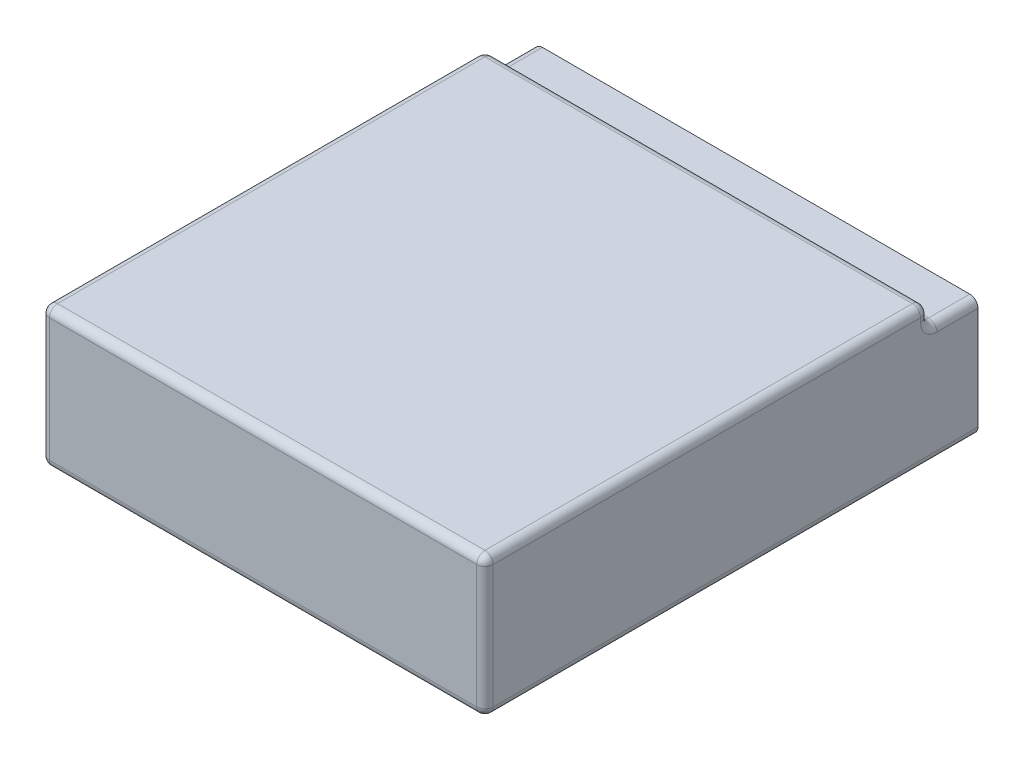
ISO-10303-21;
HEADER;
FILE_DESCRIPTION(('STEP AP214'),'2;1');
FILE_NAME('part.step','',(''),(''),'','','');
FILE_SCHEMA(('AUTOMOTIVE_DESIGN { 1 0 10303 214 1 1 1 1 }'));
ENDSEC;
DATA;
#1=APPLICATION_CONTEXT('core data for automotive mechanical design processes');
#2=APPLICATION_PROTOCOL_DEFINITION('international standard','automotive_design',2000,#1);
#3=PRODUCT_CONTEXT('',#1,'mechanical');
#4=PRODUCT('Part','Part','',(#3));
#5=PRODUCT_RELATED_PRODUCT_CATEGORY('part','',(#4));
#6=PRODUCT_DEFINITION_FORMATION('','',#4);
#7=PRODUCT_DEFINITION_CONTEXT('part definition',#1,'design');
#8=PRODUCT_DEFINITION('design','',#6,#7);
#9=PRODUCT_DEFINITION_SHAPE('','',#8);
#10=(LENGTH_UNIT() NAMED_UNIT(*) SI_UNIT(.MILLI.,.METRE.));
#11=(NAMED_UNIT(*) PLANE_ANGLE_UNIT() SI_UNIT($,.RADIAN.));
#12=(NAMED_UNIT(*) SI_UNIT($,.STERADIAN.) SOLID_ANGLE_UNIT());
#13=UNCERTAINTY_MEASURE_WITH_UNIT(LENGTH_MEASURE(1.E-05),#10,'distance_accuracy_value','');
#14=(GEOMETRIC_REPRESENTATION_CONTEXT(3) GLOBAL_UNCERTAINTY_ASSIGNED_CONTEXT((#13)) GLOBAL_UNIT_ASSIGNED_CONTEXT((#10,
#11,#12)) REPRESENTATION_CONTEXT('',''));
#15=CARTESIAN_POINT('',(0.,0.,0.));
#16=DIRECTION('',(0.,0.,1.));
#17=DIRECTION('',(1.,0.,0.));
#18=AXIS2_PLACEMENT_3D('',#15,#16,#17);
#19=CARTESIAN_POINT('',(-29.0445265915073,17.,-29.770639756295));
#20=DIRECTION('',(1.,0.,0.));
#21=DIRECTION('',(0.,0.,-1.));
#22=AXIS2_PLACEMENT_3D('',#19,#20,#21);
#23=PLANE('',#22);
#24=CARTESIAN_POINT('',(-29.0445265915073,15.5,-24.770639756295));
#25=DIRECTION('',(1.,0.,0.));
#26=DIRECTION('',(0.,0.,-1.));
#27=AXIS2_PLACEMENT_3D('',#24,#25,#26);
#28=CIRCLE('',#27,2.);
#29=CARTESIAN_POINT('',(-29.0445265915073,13.5,-24.770639756295));
#30=VERTEX_POINT('',#29);
#31=CARTESIAN_POINT('',(-29.0445265915073,15.5,-22.770639756295));
#32=VERTEX_POINT('',#31);
#33=EDGE_CURVE('E322',#30,#32,#28,.F.);
#34=ORIENTED_EDGE('',*,*,#33,.F.);
#35=DIRECTION('',(0.,0.,1.));
#36=VECTOR('',#35,1.);
#37=CARTESIAN_POINT('',(-29.0445265915073,13.5,-29.770639756295));
#38=LINE('',#37,#36);
#39=CARTESIAN_POINT('',(-29.0445265915073,13.5,-29.770639756295));
#40=VERTEX_POINT('',#39);
#41=EDGE_CURVE('E325',#30,#40,#38,.F.);
#42=ORIENTED_EDGE('',*,*,#41,.T.);
#43=DIRECTION('',(0.,-1.,0.));
#44=VECTOR('',#43,1.);
#45=CARTESIAN_POINT('',(-29.0445265915073,17.,-29.770639756295));
#46=LINE('',#45,#44);
#47=CARTESIAN_POINT('',(-29.0445265915073,1.,-29.770639756295));
#48=VERTEX_POINT('',#47);
#49=EDGE_CURVE('E306',#40,#48,#46,.T.);
#50=ORIENTED_EDGE('',*,*,#49,.T.);
#51=DIRECTION('',(0.,0.,1.));
#52=VECTOR('',#51,1.);
#53=CARTESIAN_POINT('',(-29.0445265915073,1.,-29.770639756295));
#54=LINE('',#53,#52);
#55=CARTESIAN_POINT('',(-29.0445265915073,1.,29.229360243705));
#56=VERTEX_POINT('',#55);
#57=EDGE_CURVE('E318',#48,#56,#54,.T.);
#58=ORIENTED_EDGE('',*,*,#57,.T.);
#59=DIRECTION('',(0.,-1.,0.));
#60=VECTOR('',#59,1.);
#61=CARTESIAN_POINT('',(-29.0445265915073,17.,29.229360243705));
#62=LINE('',#61,#60);
#63=CARTESIAN_POINT('',(-29.0445265915073,16.,29.229360243705));
#64=VERTEX_POINT('',#63);
#65=EDGE_CURVE('E314',#56,#64,#62,.F.);
#66=ORIENTED_EDGE('',*,*,#65,.T.);
#67=DIRECTION('',(0.,0.,1.));
#68=VECTOR('',#67,1.);
#69=CARTESIAN_POINT('',(-29.0445265915073,16.,-23.770639756295));
#70=LINE('',#69,#68);
#71=CARTESIAN_POINT('',(-29.0445265915073,16.,-22.770639756295));
#72=VERTEX_POINT('',#71);
#73=EDGE_CURVE('E316',#64,#72,#70,.F.);
#74=ORIENTED_EDGE('',*,*,#73,.T.);
#75=DIRECTION('',(0.,1.,0.));
#76=VECTOR('',#75,1.);
#77=CARTESIAN_POINT('',(-29.0445265915073,17.,-22.770639756295));
#78=LINE('',#77,#76);
#79=EDGE_CURVE('E320',#72,#32,#78,.F.);
#80=ORIENTED_EDGE('',*,*,#79,.T.);
#81=EDGE_LOOP('',(#34,#42,#50,#58,#66,#74,#80));
#82=FACE_BOUND('',#81,.T.);
#83=ADVANCED_FACE('F33',(#82),#23,.F.);
#84=CARTESIAN_POINT('',(-29.0445265915073,17.,30.229360243705));
#85=DIRECTION('',(0.,0.,-1.));
#86=DIRECTION('',(-1.,0.,0.));
#87=AXIS2_PLACEMENT_3D('',#84,#85,#86);
#88=PLANE('',#87);
#89=DIRECTION('',(1.,0.,0.));
#90=VECTOR('',#89,1.);
#91=CARTESIAN_POINT('',(-29.0445265915073,16.,30.229360243705));
#92=LINE('',#91,#90);
#93=CARTESIAN_POINT('',(23.9554734084927,16.,30.229360243705));
#94=VERTEX_POINT('',#93);
#95=CARTESIAN_POINT('',(-28.0445265915073,16.,30.229360243705));
#96=VERTEX_POINT('',#95);
#97=EDGE_CURVE('E53',#94,#96,#92,.F.);
#98=ORIENTED_EDGE('',*,*,#97,.T.);
#99=DIRECTION('',(0.,-1.,0.));
#100=VECTOR('',#99,1.);
#101=CARTESIAN_POINT('',(-28.0445265915073,17.,30.229360243705));
#102=LINE('',#101,#100);
#103=CARTESIAN_POINT('',(-28.0445265915073,1.,30.229360243705));
#104=VERTEX_POINT('',#103);
#105=EDGE_CURVE('E11',#96,#104,#102,.T.);
#106=ORIENTED_EDGE('',*,*,#105,.T.);
#107=DIRECTION('',(1.,0.,0.));
#108=VECTOR('',#107,1.);
#109=CARTESIAN_POINT('',(-29.0445265915073,1.,30.229360243705));
#110=LINE('',#109,#108);
#111=CARTESIAN_POINT('',(23.9554734084927,1.,30.229360243705));
#112=VERTEX_POINT('',#111);
#113=EDGE_CURVE('E42',#104,#112,#110,.T.);
#114=ORIENTED_EDGE('',*,*,#113,.T.);
#115=DIRECTION('',(0.,-1.,0.));
#116=VECTOR('',#115,1.);
#117=CARTESIAN_POINT('',(23.9554734084927,17.,30.229360243705));
#118=LINE('',#117,#116);
#119=EDGE_CURVE('E221',#112,#94,#118,.F.);
#120=ORIENTED_EDGE('',*,*,#119,.T.);
#121=EDGE_LOOP('',(#98,#106,#114,#120));
#122=FACE_BOUND('',#121,.T.);
#123=ADVANCED_FACE('F383',(#122),#88,.F.);
#124=CARTESIAN_POINT('',(24.9554734084927,17.,-29.770639756295));
#125=DIRECTION('',(-1.,0.,0.));
#126=DIRECTION('',(0.,0.,1.));
#127=AXIS2_PLACEMENT_3D('',#124,#125,#126);
#128=PLANE('',#127);
#129=DIRECTION('',(0.,-1.,0.));
#130=VECTOR('',#129,1.);
#131=CARTESIAN_POINT('',(24.9554734084927,17.,29.229360243705));
#132=LINE('',#131,#130);
#133=CARTESIAN_POINT('',(24.9554734084927,16.,29.229360243705));
#134=VERTEX_POINT('',#133);
#135=CARTESIAN_POINT('',(24.9554734084927,1.,29.229360243705));
#136=VERTEX_POINT('',#135);
#137=EDGE_CURVE('E187',#134,#136,#132,.T.);
#138=ORIENTED_EDGE('',*,*,#137,.T.);
#139=DIRECTION('',(0.,0.,-1.));
#140=VECTOR('',#139,1.);
#141=CARTESIAN_POINT('',(24.9554734084927,1.,-29.770639756295));
#142=LINE('',#141,#140);
#143=CARTESIAN_POINT('',(24.9554734084927,1.,-29.770639756295));
#144=VERTEX_POINT('',#143);
#145=EDGE_CURVE('E195',#136,#144,#142,.T.);
#146=ORIENTED_EDGE('',*,*,#145,.T.);
#147=DIRECTION('',(0.,-1.,0.));
#148=VECTOR('',#147,1.);
#149=CARTESIAN_POINT('',(24.9554734084927,17.,-29.770639756295));
#150=LINE('',#149,#148);
#151=CARTESIAN_POINT('',(24.9554734084927,13.5,-29.770639756295));
#152=VERTEX_POINT('',#151);
#153=EDGE_CURVE('E303',#152,#144,#150,.T.);
#154=ORIENTED_EDGE('',*,*,#153,.F.);
#155=DIRECTION('',(0.,0.,-1.));
#156=VECTOR('',#155,1.);
#157=CARTESIAN_POINT('',(24.9554734084927,13.5,-29.770639756295));
#158=LINE('',#157,#156);
#159=CARTESIAN_POINT('',(24.9554734084927,13.5,-24.770639756295));
#160=VERTEX_POINT('',#159);
#161=EDGE_CURVE('E177',#152,#160,#158,.F.);
#162=ORIENTED_EDGE('',*,*,#161,.T.);
#163=CARTESIAN_POINT('',(24.9554734084927,15.5,-24.770639756295));
#164=DIRECTION('',(-1.,0.,0.));
#165=DIRECTION('',(0.,0.,1.));
#166=AXIS2_PLACEMENT_3D('',#163,#164,#165);
#167=CIRCLE('',#166,2.);
#168=CARTESIAN_POINT('',(24.9554734084927,15.5,-22.770639756295));
#169=VERTEX_POINT('',#168);
#170=EDGE_CURVE('E191',#169,#160,#167,.F.);
#171=ORIENTED_EDGE('',*,*,#170,.F.);
#172=DIRECTION('',(0.,1.,0.));
#173=VECTOR('',#172,1.);
#174=CARTESIAN_POINT('',(24.9554734084927,17.,-22.770639756295));
#175=LINE('',#174,#173);
#176=CARTESIAN_POINT('',(24.9554734084927,16.,-22.770639756295));
#177=VERTEX_POINT('',#176);
#178=EDGE_CURVE('E189',#169,#177,#175,.T.);
#179=ORIENTED_EDGE('',*,*,#178,.T.);
#180=DIRECTION('',(0.,0.,-1.));
#181=VECTOR('',#180,1.);
#182=CARTESIAN_POINT('',(24.9554734084927,16.,30.229360243705));
#183=LINE('',#182,#181);
#184=EDGE_CURVE('E180',#177,#134,#183,.F.);
#185=ORIENTED_EDGE('',*,*,#184,.T.);
#186=EDGE_LOOP('',(#138,#146,#154,#162,#171,#179,#185));
#187=FACE_BOUND('',#186,.T.);
#188=ADVANCED_FACE('F302',(#187),#128,.F.);
#189=CARTESIAN_POINT('',(-29.0445265915073,17.,-29.770639756295));
#190=DIRECTION('',(0.,0.,1.));
#191=DIRECTION('',(1.,0.,0.));
#192=AXIS2_PLACEMENT_3D('',#189,#190,#191);
#193=PLANE('',#192);
#194=ORIENTED_EDGE('',*,*,#49,.F.);
#195=CARTESIAN_POINT('',(-28.0445265915073,13.5,-29.770639756295));
#196=DIRECTION('',(0.,0.,1.));
#197=DIRECTION('',(1.,0.,0.));
#198=AXIS2_PLACEMENT_3D('',#195,#196,#197);
#199=CIRCLE('',#198,1.);
#200=CARTESIAN_POINT('',(-28.0445265915073,14.5,-29.770639756295));
#201=VERTEX_POINT('',#200);
#202=EDGE_CURVE('E172',#40,#201,#199,.F.);
#203=ORIENTED_EDGE('',*,*,#202,.T.);
#204=DIRECTION('',(-1.,0.,0.));
#205=VECTOR('',#204,1.);
#206=CARTESIAN_POINT('',(-29.0445265915073,14.5,-29.770639756295));
#207=LINE('',#206,#205);
#208=CARTESIAN_POINT('',(23.9554734084927,14.5,-29.770639756295));
#209=VERTEX_POINT('',#208);
#210=EDGE_CURVE('E155',#209,#201,#207,.T.);
#211=ORIENTED_EDGE('',*,*,#210,.F.);
#212=CARTESIAN_POINT('',(23.9554734084927,13.5,-29.770639756295));
#213=DIRECTION('',(0.,0.,1.));
#214=DIRECTION('',(1.,0.,0.));
#215=AXIS2_PLACEMENT_3D('',#212,#213,#214);
#216=CIRCLE('',#215,1.);
#217=EDGE_CURVE('E169',#209,#152,#216,.F.);
#218=ORIENTED_EDGE('',*,*,#217,.T.);
#219=ORIENTED_EDGE('',*,*,#153,.T.);
#220=CARTESIAN_POINT('',(23.9554734084927,1.,-29.770639756295));
#221=DIRECTION('',(0.,0.,1.));
#222=DIRECTION('',(1.,0.,0.));
#223=AXIS2_PLACEMENT_3D('',#220,#221,#222);
#224=CIRCLE('',#223,1.);
#225=CARTESIAN_POINT('',(23.9554734084927,0.,-29.770639756295));
#226=VERTEX_POINT('',#225);
#227=EDGE_CURVE('E182',#144,#226,#224,.F.);
#228=ORIENTED_EDGE('',*,*,#227,.T.);
#229=DIRECTION('',(-1.,0.,0.));
#230=VECTOR('',#229,1.);
#231=CARTESIAN_POINT('',(-29.0445265915073,0.,-29.770639756295));
#232=LINE('',#231,#230);
#233=CARTESIAN_POINT('',(-28.0445265915073,0.,-29.770639756295));
#234=VERTEX_POINT('',#233);
#235=EDGE_CURVE('E173',#226,#234,#232,.T.);
#236=ORIENTED_EDGE('',*,*,#235,.T.);
#237=CARTESIAN_POINT('',(-28.0445265915073,1.,-29.770639756295));
#238=DIRECTION('',(0.,0.,1.));
#239=DIRECTION('',(1.,0.,0.));
#240=AXIS2_PLACEMENT_3D('',#237,#238,#239);
#241=CIRCLE('',#240,1.);
#242=EDGE_CURVE('E178',#234,#48,#241,.F.);
#243=ORIENTED_EDGE('',*,*,#242,.T.);
#244=EDGE_LOOP('',(#194,#203,#211,#218,#219,#228,#236,#243));
#245=FACE_BOUND('',#244,.T.);
#246=ADVANCED_FACE('F167',(#245),#193,.F.);
#247=CARTESIAN_POINT('',(0.,17.,0.));
#248=DIRECTION('',(0.,1.,0.));
#249=DIRECTION('',(0.,0.,1.));
#250=AXIS2_PLACEMENT_3D('',#247,#248,#249);
#251=PLANE('',#250);
#252=DIRECTION('',(0.,0.,-1.));
#253=VECTOR('',#252,1.);
#254=CARTESIAN_POINT('',(23.9554734084927,17.,-23.770639756295));
#255=LINE('',#254,#253);
#256=CARTESIAN_POINT('',(23.9554734084927,17.,29.229360243705));
#257=VERTEX_POINT('',#256);
#258=CARTESIAN_POINT('',(23.9554734084927,17.,-22.770639756295));
#259=VERTEX_POINT('',#258);
#260=EDGE_CURVE('E206',#257,#259,#255,.T.);
#261=ORIENTED_EDGE('',*,*,#260,.T.);
#262=DIRECTION('',(1.,0.,0.));
#263=VECTOR('',#262,1.);
#264=CARTESIAN_POINT('',(-29.0445265915073,17.,-22.770639756295));
#265=LINE('',#264,#263);
#266=CARTESIAN_POINT('',(-28.0445265915073,17.,-22.770639756295));
#267=VERTEX_POINT('',#266);
#268=EDGE_CURVE('E212',#259,#267,#265,.F.);
#269=ORIENTED_EDGE('',*,*,#268,.T.);
#270=DIRECTION('',(0.,0.,1.));
#271=VECTOR('',#270,1.);
#272=CARTESIAN_POINT('',(-28.0445265915073,17.,30.229360243705));
#273=LINE('',#272,#271);
#274=CARTESIAN_POINT('',(-28.0445265915073,17.,29.229360243705));
#275=VERTEX_POINT('',#274);
#276=EDGE_CURVE('E210',#267,#275,#273,.T.);
#277=ORIENTED_EDGE('',*,*,#276,.T.);
#278=DIRECTION('',(1.,0.,0.));
#279=VECTOR('',#278,1.);
#280=CARTESIAN_POINT('',(24.9554734084927,17.,29.229360243705));
#281=LINE('',#280,#279);
#282=EDGE_CURVE('E208',#275,#257,#281,.T.);
#283=ORIENTED_EDGE('',*,*,#282,.T.);
#284=EDGE_LOOP('',(#261,#269,#277,#283));
#285=FACE_BOUND('',#284,.T.);
#286=ADVANCED_FACE('F459',(#285),#251,.T.);
#287=CARTESIAN_POINT('',(0.,0.,0.));
#288=DIRECTION('',(0.,1.,0.));
#289=DIRECTION('',(0.,0.,1.));
#290=AXIS2_PLACEMENT_3D('',#287,#288,#289);
#291=PLANE('',#290);
#292=DIRECTION('',(1.,0.,0.));
#293=VECTOR('',#292,1.);
#294=CARTESIAN_POINT('',(0.,0.,29.229360243705));
#295=LINE('',#294,#293);
#296=CARTESIAN_POINT('',(23.9554734084927,0.,29.229360243705));
#297=VERTEX_POINT('',#296);
#298=CARTESIAN_POINT('',(-28.0445265915073,0.,29.229360243705));
#299=VERTEX_POINT('',#298);
#300=EDGE_CURVE('E217',#297,#299,#295,.F.);
#301=ORIENTED_EDGE('',*,*,#300,.T.);
#302=DIRECTION('',(0.,0.,1.));
#303=VECTOR('',#302,1.);
#304=CARTESIAN_POINT('',(-28.0445265915073,0.,0.));
#305=LINE('',#304,#303);
#306=EDGE_CURVE('E219',#299,#234,#305,.F.);
#307=ORIENTED_EDGE('',*,*,#306,.T.);
#308=ORIENTED_EDGE('',*,*,#235,.F.);
#309=DIRECTION('',(0.,0.,-1.));
#310=VECTOR('',#309,1.);
#311=CARTESIAN_POINT('',(23.9554734084927,0.,0.));
#312=LINE('',#311,#310);
#313=EDGE_CURVE('E215',#226,#297,#312,.F.);
#314=ORIENTED_EDGE('',*,*,#313,.T.);
#315=EDGE_LOOP('',(#301,#307,#308,#314));
#316=FACE_BOUND('',#315,.T.);
#317=ADVANCED_FACE('F455',(#316),#291,.F.);
#318=CARTESIAN_POINT('',(-29.0445265915073,14.5,-23.770639756295));
#319=DIRECTION('',(0.,0.,1.));
#320=DIRECTION('',(1.,0.,0.));
#321=AXIS2_PLACEMENT_3D('',#318,#319,#320);
#322=PLANE('',#321);
#323=DIRECTION('',(0.,1.,0.));
#324=VECTOR('',#323,1.);
#325=CARTESIAN_POINT('',(23.9554734084927,14.5,-23.770639756295));
#326=LINE('',#325,#324);
#327=CARTESIAN_POINT('',(23.9554734084927,16.,-23.770639756295));
#328=VERTEX_POINT('',#327);
#329=CARTESIAN_POINT('',(23.9554734084927,15.5,-23.770639756295));
#330=VERTEX_POINT('',#329);
#331=EDGE_CURVE('E199',#328,#330,#326,.F.);
#332=ORIENTED_EDGE('',*,*,#331,.T.);
#333=DIRECTION('',(1.,0.,0.));
#334=VECTOR('',#333,1.);
#335=CARTESIAN_POINT('',(-29.0445265915073,15.5,-23.770639756295));
#336=LINE('',#335,#334);
#337=CARTESIAN_POINT('',(-28.0445265915073,15.5,-23.770639756295));
#338=VERTEX_POINT('',#337);
#339=EDGE_CURVE('E204',#330,#338,#336,.F.);
#340=ORIENTED_EDGE('',*,*,#339,.T.);
#341=DIRECTION('',(0.,1.,0.));
#342=VECTOR('',#341,1.);
#343=CARTESIAN_POINT('',(-28.0445265915073,14.5,-23.770639756295));
#344=LINE('',#343,#342);
#345=CARTESIAN_POINT('',(-28.0445265915073,16.,-23.770639756295));
#346=VERTEX_POINT('',#345);
#347=EDGE_CURVE('E201',#338,#346,#344,.T.);
#348=ORIENTED_EDGE('',*,*,#347,.T.);
#349=DIRECTION('',(1.,0.,0.));
#350=VECTOR('',#349,1.);
#351=CARTESIAN_POINT('',(24.9554734084927,16.,-23.770639756295));
#352=LINE('',#351,#350);
#353=EDGE_CURVE('E197',#346,#328,#352,.T.);
#354=ORIENTED_EDGE('',*,*,#353,.T.);
#355=EDGE_LOOP('',(#332,#340,#348,#354));
#356=FACE_BOUND('',#355,.T.);
#357=ADVANCED_FACE('F450',(#356),#322,.F.);
#358=CARTESIAN_POINT('',(0.,14.5,0.));
#359=DIRECTION('',(0.,-1.,0.));
#360=DIRECTION('',(0.,0.,-1.));
#361=AXIS2_PLACEMENT_3D('',#358,#359,#360);
#362=PLANE('',#361);
#363=ORIENTED_EDGE('',*,*,#210,.T.);
#364=DIRECTION('',(0.,0.,1.));
#365=VECTOR('',#364,1.);
#366=CARTESIAN_POINT('',(-28.0445265915073,14.5,0.));
#367=LINE('',#366,#365);
#368=CARTESIAN_POINT('',(-28.0445265915073,14.5,-24.770639756295));
#369=VERTEX_POINT('',#368);
#370=EDGE_CURVE('E163',#201,#369,#367,.T.);
#371=ORIENTED_EDGE('',*,*,#370,.T.);
#372=DIRECTION('',(1.,0.,0.));
#373=VECTOR('',#372,1.);
#374=CARTESIAN_POINT('',(24.9554734084927,14.5,-24.770639756295));
#375=LINE('',#374,#373);
#376=CARTESIAN_POINT('',(23.9554734084927,14.5,-24.770639756295));
#377=VERTEX_POINT('',#376);
#378=EDGE_CURVE('E158',#369,#377,#375,.T.);
#379=ORIENTED_EDGE('',*,*,#378,.T.);
#380=DIRECTION('',(0.,0.,-1.));
#381=VECTOR('',#380,1.);
#382=CARTESIAN_POINT('',(23.9554734084927,14.5,0.));
#383=LINE('',#382,#381);
#384=EDGE_CURVE('E151',#377,#209,#383,.T.);
#385=ORIENTED_EDGE('',*,*,#384,.T.);
#386=EDGE_LOOP('',(#363,#371,#379,#385));
#387=FACE_BOUND('',#386,.T.);
#388=ADVANCED_FACE('F153',(#387),#362,.F.);
#389=CARTESIAN_POINT('',(23.9554734084927,1.,-29.770639756295));
#390=DIRECTION('',(0.,0.,-1.));
#391=DIRECTION('',(-1.,0.,0.));
#392=AXIS2_PLACEMENT_3D('',#389,#390,#391);
#393=CYLINDRICAL_SURFACE('',#392,1.);
#394=CARTESIAN_POINT('',(23.9554734084927,1.,29.229360243705));
#395=DIRECTION('',(0.,0.,1.));
#396=DIRECTION('',(1.,0.,0.));
#397=AXIS2_PLACEMENT_3D('',#394,#395,#396);
#398=CIRCLE('',#397,1.);
#399=EDGE_CURVE('E37',#297,#136,#398,.T.);
#400=ORIENTED_EDGE('',*,*,#399,.F.);
#401=ORIENTED_EDGE('',*,*,#313,.F.);
#402=ORIENTED_EDGE('',*,*,#227,.F.);
#403=ORIENTED_EDGE('',*,*,#145,.F.);
#404=EDGE_LOOP('',(#400,#401,#402,#403));
#405=FACE_BOUND('',#404,.T.);
#406=ADVANCED_FACE('F35',(#405),#393,.T.);
#407=CARTESIAN_POINT('',(23.9554734084927,1.,29.229360243705));
#408=DIRECTION('',(0.,0.,1.));
#409=DIRECTION('',(1.,0.,0.));
#410=AXIS2_PLACEMENT_3D('',#407,#408,#409);
#411=SPHERICAL_SURFACE('',#410,1.);
#412=CARTESIAN_POINT('',(23.9554734084927,1.,29.229360243705));
#413=DIRECTION('',(1.,0.,0.));
#414=DIRECTION('',(0.,0.,-1.));
#415=AXIS2_PLACEMENT_3D('',#412,#413,#414);
#416=CIRCLE('',#415,1.);
#417=EDGE_CURVE('E284',#297,#112,#416,.F.);
#418=ORIENTED_EDGE('',*,*,#417,.F.);
#419=ORIENTED_EDGE('',*,*,#399,.T.);
#420=CARTESIAN_POINT('',(23.9554734084927,1.,29.229360243705));
#421=DIRECTION('',(0.,-1.,0.));
#422=DIRECTION('',(0.,0.,-1.));
#423=AXIS2_PLACEMENT_3D('',#420,#421,#422);
#424=CIRCLE('',#423,1.);
#425=EDGE_CURVE('E286',#112,#136,#424,.F.);
#426=ORIENTED_EDGE('',*,*,#425,.F.);
#427=EDGE_LOOP('',(#418,#419,#426));
#428=FACE_BOUND('',#427,.T.);
#429=ADVANCED_FACE('F295',(#428),#411,.T.);
#430=CARTESIAN_POINT('',(23.9554734084927,17.,29.229360243705));
#431=DIRECTION('',(0.,-1.,0.));
#432=DIRECTION('',(0.,0.,-1.));
#433=AXIS2_PLACEMENT_3D('',#430,#431,#432);
#434=CYLINDRICAL_SURFACE('',#433,1.);
#435=ORIENTED_EDGE('',*,*,#425,.T.);
#436=ORIENTED_EDGE('',*,*,#137,.F.);
#437=CARTESIAN_POINT('',(23.9554734084927,16.,29.229360243705));
#438=DIRECTION('',(0.,1.,0.));
#439=DIRECTION('',(0.,0.,1.));
#440=AXIS2_PLACEMENT_3D('',#437,#438,#439);
#441=CIRCLE('',#440,1.);
#442=EDGE_CURVE('E281',#94,#134,#441,.T.);
#443=ORIENTED_EDGE('',*,*,#442,.F.);
#444=ORIENTED_EDGE('',*,*,#119,.F.);
#445=EDGE_LOOP('',(#435,#436,#443,#444));
#446=FACE_BOUND('',#445,.T.);
#447=ADVANCED_FACE('F360',(#446),#434,.T.);
#448=CARTESIAN_POINT('',(-29.0445265915073,1.,29.229360243705));
#449=DIRECTION('',(1.,0.,0.));
#450=DIRECTION('',(0.,0.,-1.));
#451=AXIS2_PLACEMENT_3D('',#448,#449,#450);
#452=CYLINDRICAL_SURFACE('',#451,1.);
#453=ORIENTED_EDGE('',*,*,#417,.T.);
#454=ORIENTED_EDGE('',*,*,#113,.F.);
#455=CARTESIAN_POINT('',(-28.0445265915073,1.,29.229360243705));
#456=DIRECTION('',(-1.,0.,0.));
#457=DIRECTION('',(0.,0.,1.));
#458=AXIS2_PLACEMENT_3D('',#455,#456,#457);
#459=CIRCLE('',#458,1.);
#460=EDGE_CURVE('E278',#299,#104,#459,.T.);
#461=ORIENTED_EDGE('',*,*,#460,.F.);
#462=ORIENTED_EDGE('',*,*,#300,.F.);
#463=EDGE_LOOP('',(#453,#454,#461,#462));
#464=FACE_BOUND('',#463,.T.);
#465=ADVANCED_FACE('F382',(#464),#452,.T.);
#466=CARTESIAN_POINT('',(-28.0445265915073,1.,-29.770639756295));
#467=DIRECTION('',(0.,0.,1.));
#468=DIRECTION('',(1.,0.,0.));
#469=AXIS2_PLACEMENT_3D('',#466,#467,#468);
#470=CYLINDRICAL_SURFACE('',#469,1.);
#471=ORIENTED_EDGE('',*,*,#242,.F.);
#472=ORIENTED_EDGE('',*,*,#306,.F.);
#473=CARTESIAN_POINT('',(-28.0445265915073,1.,29.229360243705));
#474=DIRECTION('',(0.,0.,1.));
#475=DIRECTION('',(1.,0.,0.));
#476=AXIS2_PLACEMENT_3D('',#473,#474,#475);
#477=CIRCLE('',#476,1.);
#478=EDGE_CURVE('E275',#56,#299,#477,.T.);
#479=ORIENTED_EDGE('',*,*,#478,.F.);
#480=ORIENTED_EDGE('',*,*,#57,.F.);
#481=EDGE_LOOP('',(#471,#472,#479,#480));
#482=FACE_BOUND('',#481,.T.);
#483=ADVANCED_FACE('F436',(#482),#470,.T.);
#484=CARTESIAN_POINT('',(23.9554734084927,16.,29.229360243705));
#485=DIRECTION('',(0.,0.,1.));
#486=DIRECTION('',(1.,0.,0.));
#487=AXIS2_PLACEMENT_3D('',#484,#485,#486);
#488=SPHERICAL_SURFACE('',#487,1.);
#489=CARTESIAN_POINT('',(23.9554734084927,16.,29.229360243705));
#490=DIRECTION('',(1.,0.,0.));
#491=DIRECTION('',(0.,0.,-1.));
#492=AXIS2_PLACEMENT_3D('',#489,#490,#491);
#493=CIRCLE('',#492,1.);
#494=EDGE_CURVE('E269',#94,#257,#493,.F.);
#495=ORIENTED_EDGE('',*,*,#494,.F.);
#496=ORIENTED_EDGE('',*,*,#442,.T.);
#497=CARTESIAN_POINT('',(23.9554734084927,16.,29.229360243705));
#498=DIRECTION('',(0.,0.,1.));
#499=DIRECTION('',(1.,0.,0.));
#500=AXIS2_PLACEMENT_3D('',#497,#498,#499);
#501=CIRCLE('',#500,1.);
#502=EDGE_CURVE('E272',#257,#134,#501,.F.);
#503=ORIENTED_EDGE('',*,*,#502,.F.);
#504=EDGE_LOOP('',(#495,#496,#503));
#505=FACE_BOUND('',#504,.T.);
#506=ADVANCED_FACE('F363',(#505),#488,.T.);
#507=CARTESIAN_POINT('',(-28.0445265915073,1.,29.229360243705));
#508=DIRECTION('',(0.,0.,1.));
#509=DIRECTION('',(1.,0.,0.));
#510=AXIS2_PLACEMENT_3D('',#507,#508,#509);
#511=SPHERICAL_SURFACE('',#510,1.);
#512=ORIENTED_EDGE('',*,*,#478,.T.);
#513=ORIENTED_EDGE('',*,*,#460,.T.);
#514=CARTESIAN_POINT('',(-28.0445265915073,1.,29.229360243705));
#515=DIRECTION('',(0.,-1.,0.));
#516=DIRECTION('',(0.,0.,-1.));
#517=AXIS2_PLACEMENT_3D('',#514,#515,#516);
#518=CIRCLE('',#517,1.);
#519=EDGE_CURVE('E266',#56,#104,#518,.F.);
#520=ORIENTED_EDGE('',*,*,#519,.F.);
#521=EDGE_LOOP('',(#512,#513,#520));
#522=FACE_BOUND('',#521,.T.);
#523=ADVANCED_FACE('F378',(#522),#511,.T.);
#524=CARTESIAN_POINT('',(23.9554734084927,16.,0.));
#525=DIRECTION('',(0.,0.,1.));
#526=DIRECTION('',(1.,0.,0.));
#527=AXIS2_PLACEMENT_3D('',#524,#525,#526);
#528=CYLINDRICAL_SURFACE('',#527,1.);
#529=ORIENTED_EDGE('',*,*,#502,.T.);
#530=ORIENTED_EDGE('',*,*,#184,.F.);
#531=CARTESIAN_POINT('',(23.9554734084927,16.,-22.770639756295));
#532=DIRECTION('',(0.,0.,-1.));
#533=DIRECTION('',(-1.,0.,0.));
#534=AXIS2_PLACEMENT_3D('',#531,#532,#533);
#535=CIRCLE('',#534,1.);
#536=EDGE_CURVE('E263',#259,#177,#535,.T.);
#537=ORIENTED_EDGE('',*,*,#536,.F.);
#538=ORIENTED_EDGE('',*,*,#260,.F.);
#539=EDGE_LOOP('',(#529,#530,#537,#538));
#540=FACE_BOUND('',#539,.T.);
#541=ADVANCED_FACE('F357',(#540),#528,.T.);
#542=CARTESIAN_POINT('',(0.,16.,29.229360243705));
#543=DIRECTION('',(-1.,0.,0.));
#544=DIRECTION('',(0.,0.,1.));
#545=AXIS2_PLACEMENT_3D('',#542,#543,#544);
#546=CYLINDRICAL_SURFACE('',#545,1.);
#547=ORIENTED_EDGE('',*,*,#494,.T.);
#548=ORIENTED_EDGE('',*,*,#282,.F.);
#549=CARTESIAN_POINT('',(-28.0445265915073,16.,29.229360243705));
#550=DIRECTION('',(-1.,0.,0.));
#551=DIRECTION('',(0.,0.,1.));
#552=AXIS2_PLACEMENT_3D('',#549,#550,#551);
#553=CIRCLE('',#552,1.);
#554=EDGE_CURVE('E260',#96,#275,#553,.T.);
#555=ORIENTED_EDGE('',*,*,#554,.F.);
#556=ORIENTED_EDGE('',*,*,#97,.F.);
#557=EDGE_LOOP('',(#547,#548,#555,#556));
#558=FACE_BOUND('',#557,.T.);
#559=ADVANCED_FACE('F367',(#558),#546,.T.);
#560=CARTESIAN_POINT('',(-28.0445265915073,17.,29.229360243705));
#561=DIRECTION('',(0.,-1.,0.));
#562=DIRECTION('',(0.,0.,-1.));
#563=AXIS2_PLACEMENT_3D('',#560,#561,#562);
#564=CYLINDRICAL_SURFACE('',#563,1.);
#565=ORIENTED_EDGE('',*,*,#519,.T.);
#566=ORIENTED_EDGE('',*,*,#105,.F.);
#567=CARTESIAN_POINT('',(-28.0445265915073,16.,29.229360243705));
#568=DIRECTION('',(0.,1.,0.));
#569=DIRECTION('',(0.,0.,1.));
#570=AXIS2_PLACEMENT_3D('',#567,#568,#569);
#571=CIRCLE('',#570,1.);
#572=EDGE_CURVE('E257',#64,#96,#571,.T.);
#573=ORIENTED_EDGE('',*,*,#572,.F.);
#574=ORIENTED_EDGE('',*,*,#65,.F.);
#575=EDGE_LOOP('',(#565,#566,#573,#574));
#576=FACE_BOUND('',#575,.T.);
#577=ADVANCED_FACE('F375',(#576),#564,.T.);
#578=CARTESIAN_POINT('',(23.9554734084927,16.,-22.770639756295));
#579=DIRECTION('',(0.,0.,1.));
#580=DIRECTION('',(1.,0.,0.));
#581=AXIS2_PLACEMENT_3D('',#578,#579,#580);
#582=SPHERICAL_SURFACE('',#581,1.);
#583=CARTESIAN_POINT('',(23.9554734084927,16.,-22.770639756295));
#584=DIRECTION('',(1.,0.,0.));
#585=DIRECTION('',(0.,0.,-1.));
#586=AXIS2_PLACEMENT_3D('',#583,#584,#585);
#587=CIRCLE('',#586,1.);
#588=EDGE_CURVE('E251',#259,#328,#587,.F.);
#589=ORIENTED_EDGE('',*,*,#588,.F.);
#590=ORIENTED_EDGE('',*,*,#536,.T.);
#591=CARTESIAN_POINT('',(23.9554734084927,16.,-22.770639756295));
#592=DIRECTION('',(0.,1.,0.));
#593=DIRECTION('',(0.,0.,1.));
#594=AXIS2_PLACEMENT_3D('',#591,#592,#593);
#595=CIRCLE('',#594,1.);
#596=EDGE_CURVE('E254',#328,#177,#595,.F.);
#597=ORIENTED_EDGE('',*,*,#596,.F.);
#598=EDGE_LOOP('',(#589,#590,#597));
#599=FACE_BOUND('',#598,.T.);
#600=ADVANCED_FACE('F352',(#599),#582,.T.);
#601=CARTESIAN_POINT('',(-28.0445265915073,16.,29.229360243705));
#602=DIRECTION('',(0.,0.,1.));
#603=DIRECTION('',(1.,0.,0.));
#604=AXIS2_PLACEMENT_3D('',#601,#602,#603);
#605=SPHERICAL_SURFACE('',#604,1.);
#606=ORIENTED_EDGE('',*,*,#572,.T.);
#607=ORIENTED_EDGE('',*,*,#554,.T.);
#608=CARTESIAN_POINT('',(-28.0445265915073,16.,29.229360243705));
#609=DIRECTION('',(0.,0.,1.));
#610=DIRECTION('',(1.,0.,0.));
#611=AXIS2_PLACEMENT_3D('',#608,#609,#610);
#612=CIRCLE('',#611,1.);
#613=EDGE_CURVE('E248',#64,#275,#612,.F.);
#614=ORIENTED_EDGE('',*,*,#613,.F.);
#615=EDGE_LOOP('',(#606,#607,#614));
#616=FACE_BOUND('',#615,.T.);
#617=ADVANCED_FACE('F371',(#616),#605,.T.);
#618=CARTESIAN_POINT('',(23.9554734084927,13.5,0.));
#619=DIRECTION('',(0.,0.,-1.));
#620=DIRECTION('',(-1.,0.,0.));
#621=AXIS2_PLACEMENT_3D('',#618,#619,#620);
#622=CYLINDRICAL_SURFACE('',#621,1.);
#623=ORIENTED_EDGE('',*,*,#217,.F.);
#624=ORIENTED_EDGE('',*,*,#384,.F.);
#625=CARTESIAN_POINT('',(23.9554734084927,13.5,-24.770639756295));
#626=DIRECTION('',(0.,0.,1.));
#627=DIRECTION('',(1.,0.,0.));
#628=AXIS2_PLACEMENT_3D('',#625,#626,#627);
#629=CIRCLE('',#628,1.);
#630=EDGE_CURVE('E246',#160,#377,#629,.T.);
#631=ORIENTED_EDGE('',*,*,#630,.F.);
#632=ORIENTED_EDGE('',*,*,#161,.F.);
#633=EDGE_LOOP('',(#623,#624,#631,#632));
#634=FACE_BOUND('',#633,.T.);
#635=ADVANCED_FACE('F176',(#634),#622,.T.);
#636=CARTESIAN_POINT('',(23.9554734084927,17.,-22.770639756295));
#637=DIRECTION('',(0.,1.,0.));
#638=DIRECTION('',(0.,0.,1.));
#639=AXIS2_PLACEMENT_3D('',#636,#637,#638);
#640=CYLINDRICAL_SURFACE('',#639,1.);
#641=ORIENTED_EDGE('',*,*,#596,.T.);
#642=ORIENTED_EDGE('',*,*,#178,.F.);
#643=CARTESIAN_POINT('',(23.9554734084927,15.5,-22.770639756295));
#644=DIRECTION('',(0.,-1.,0.));
#645=DIRECTION('',(0.,0.,-1.));
#646=AXIS2_PLACEMENT_3D('',#643,#644,#645);
#647=CIRCLE('',#646,1.);
#648=EDGE_CURVE('E243',#330,#169,#647,.T.);
#649=ORIENTED_EDGE('',*,*,#648,.F.);
#650=ORIENTED_EDGE('',*,*,#331,.F.);
#651=EDGE_LOOP('',(#641,#642,#649,#650));
#652=FACE_BOUND('',#651,.T.);
#653=ADVANCED_FACE('F347',(#652),#640,.T.);
#654=CARTESIAN_POINT('',(-29.0445265915073,16.,-22.770639756295));
#655=DIRECTION('',(-1.,0.,0.));
#656=DIRECTION('',(0.,0.,1.));
#657=AXIS2_PLACEMENT_3D('',#654,#655,#656);
#658=CYLINDRICAL_SURFACE('',#657,1.);
#659=ORIENTED_EDGE('',*,*,#588,.T.);
#660=ORIENTED_EDGE('',*,*,#353,.F.);
#661=CARTESIAN_POINT('',(-28.0445265915073,16.,-22.770639756295));
#662=DIRECTION('',(-1.,0.,0.));
#663=DIRECTION('',(0.,0.,1.));
#664=AXIS2_PLACEMENT_3D('',#661,#662,#663);
#665=CIRCLE('',#664,1.);
#666=EDGE_CURVE('E240',#267,#346,#665,.T.);
#667=ORIENTED_EDGE('',*,*,#666,.F.);
#668=ORIENTED_EDGE('',*,*,#268,.F.);
#669=EDGE_LOOP('',(#659,#660,#667,#668));
#670=FACE_BOUND('',#669,.T.);
#671=ADVANCED_FACE('F413',(#670),#658,.T.);
#672=CARTESIAN_POINT('',(-28.0445265915073,16.,0.));
#673=DIRECTION('',(0.,0.,-1.));
#674=DIRECTION('',(-1.,0.,0.));
#675=AXIS2_PLACEMENT_3D('',#672,#673,#674);
#676=CYLINDRICAL_SURFACE('',#675,1.);
#677=ORIENTED_EDGE('',*,*,#613,.T.);
#678=ORIENTED_EDGE('',*,*,#276,.F.);
#679=CARTESIAN_POINT('',(-28.0445265915073,16.,-22.770639756295));
#680=DIRECTION('',(0.,0.,-1.));
#681=DIRECTION('',(-1.,0.,0.));
#682=AXIS2_PLACEMENT_3D('',#679,#680,#681);
#683=CIRCLE('',#682,1.);
#684=EDGE_CURVE('E238',#72,#267,#683,.T.);
#685=ORIENTED_EDGE('',*,*,#684,.F.);
#686=ORIENTED_EDGE('',*,*,#73,.F.);
#687=EDGE_LOOP('',(#677,#678,#685,#686));
#688=FACE_BOUND('',#687,.T.);
#689=ADVANCED_FACE('F410',(#688),#676,.T.);
#690=CARTESIAN_POINT('',(23.9554734084927,15.5,-24.770639756295));
#691=DIRECTION('',(-1.,0.,0.));
#692=DIRECTION('',(0.,0.,1.));
#693=AXIS2_PLACEMENT_3D('',#690,#691,#692);
#694=TOROIDAL_SURFACE('',#693,2.,1.);
#695=ORIENTED_EDGE('',*,*,#170,.T.);
#696=ORIENTED_EDGE('',*,*,#630,.T.);
#697=CARTESIAN_POINT('',(23.9554734084927,15.5,-24.770639756295));
#698=DIRECTION('',(-1.,0.,0.));
#699=DIRECTION('',(0.,0.,1.));
#700=AXIS2_PLACEMENT_3D('',#697,#698,#699);
#701=CIRCLE('',#700,1.);
#702=EDGE_CURVE('E235',#330,#377,#701,.F.);
#703=ORIENTED_EDGE('',*,*,#702,.F.);
#704=ORIENTED_EDGE('',*,*,#648,.T.);
#705=EDGE_LOOP('',(#695,#696,#703,#704));
#706=FACE_BOUND('',#705,.T.);
#707=ADVANCED_FACE('F342',(#706),#694,.T.);
#708=CARTESIAN_POINT('',(-28.0445265915073,16.,-22.770639756295));
#709=DIRECTION('',(0.,0.,1.));
#710=DIRECTION('',(1.,0.,0.));
#711=AXIS2_PLACEMENT_3D('',#708,#709,#710);
#712=SPHERICAL_SURFACE('',#711,1.);
#713=ORIENTED_EDGE('',*,*,#684,.T.);
#714=ORIENTED_EDGE('',*,*,#666,.T.);
#715=CARTESIAN_POINT('',(-28.0445265915073,16.,-22.770639756295));
#716=DIRECTION('',(0.,1.,0.));
#717=DIRECTION('',(0.,0.,1.));
#718=AXIS2_PLACEMENT_3D('',#715,#716,#717);
#719=CIRCLE('',#718,1.);
#720=EDGE_CURVE('E233',#72,#346,#719,.F.);
#721=ORIENTED_EDGE('',*,*,#720,.F.);
#722=EDGE_LOOP('',(#713,#714,#721));
#723=FACE_BOUND('',#722,.T.);
#724=ADVANCED_FACE('F404',(#723),#712,.T.);
#725=CARTESIAN_POINT('',(0.,15.5,-24.770639756295));
#726=DIRECTION('',(-1.,0.,0.));
#727=DIRECTION('',(0.,0.,1.));
#728=AXIS2_PLACEMENT_3D('',#725,#726,#727);
#729=CYLINDRICAL_SURFACE('',#728,1.);
#730=ORIENTED_EDGE('',*,*,#702,.T.);
#731=ORIENTED_EDGE('',*,*,#378,.F.);
#732=CARTESIAN_POINT('',(-28.0445265915073,15.5,-24.770639756295));
#733=DIRECTION('',(1.,0.,0.));
#734=DIRECTION('',(0.,0.,-1.));
#735=AXIS2_PLACEMENT_3D('',#732,#733,#734);
#736=CIRCLE('',#735,1.);
#737=EDGE_CURVE('E230',#338,#369,#736,.T.);
#738=ORIENTED_EDGE('',*,*,#737,.F.);
#739=ORIENTED_EDGE('',*,*,#339,.F.);
#740=EDGE_LOOP('',(#730,#731,#738,#739));
#741=FACE_BOUND('',#740,.T.);
#742=ADVANCED_FACE('F339',(#741),#729,.F.);
#743=CARTESIAN_POINT('',(-28.0445265915073,14.5,-22.770639756295));
#744=DIRECTION('',(0.,1.,0.));
#745=DIRECTION('',(0.,0.,1.));
#746=AXIS2_PLACEMENT_3D('',#743,#744,#745);
#747=CYLINDRICAL_SURFACE('',#746,1.);
#748=ORIENTED_EDGE('',*,*,#720,.T.);
#749=ORIENTED_EDGE('',*,*,#347,.F.);
#750=CARTESIAN_POINT('',(-28.0445265915073,15.5,-22.770639756295));
#751=DIRECTION('',(0.,-1.,0.));
#752=DIRECTION('',(0.,0.,-1.));
#753=AXIS2_PLACEMENT_3D('',#750,#751,#752);
#754=CIRCLE('',#753,1.);
#755=EDGE_CURVE('E227',#32,#338,#754,.T.);
#756=ORIENTED_EDGE('',*,*,#755,.F.);
#757=ORIENTED_EDGE('',*,*,#79,.F.);
#758=EDGE_LOOP('',(#748,#749,#756,#757));
#759=FACE_BOUND('',#758,.T.);
#760=ADVANCED_FACE('F398',(#759),#747,.T.);
#761=CARTESIAN_POINT('',(-28.0445265915073,15.5,-24.770639756295));
#762=DIRECTION('',(1.,0.,0.));
#763=DIRECTION('',(0.,0.,-1.));
#764=AXIS2_PLACEMENT_3D('',#761,#762,#763);
#765=TOROIDAL_SURFACE('',#764,2.,1.);
#766=ORIENTED_EDGE('',*,*,#755,.T.);
#767=ORIENTED_EDGE('',*,*,#737,.T.);
#768=CARTESIAN_POINT('',(-28.0445265915073,13.5,-24.770639756295));
#769=DIRECTION('',(0.,0.,1.));
#770=DIRECTION('',(1.,0.,0.));
#771=AXIS2_PLACEMENT_3D('',#768,#769,#770);
#772=CIRCLE('',#771,1.);
#773=EDGE_CURVE('E225',#30,#369,#772,.F.);
#774=ORIENTED_EDGE('',*,*,#773,.F.);
#775=ORIENTED_EDGE('',*,*,#33,.T.);
#776=EDGE_LOOP('',(#766,#767,#774,#775));
#777=FACE_BOUND('',#776,.T.);
#778=ADVANCED_FACE('F335',(#777),#765,.T.);
#779=CARTESIAN_POINT('',(-28.0445265915073,13.5,0.));
#780=DIRECTION('',(0.,0.,1.));
#781=DIRECTION('',(1.,0.,0.));
#782=AXIS2_PLACEMENT_3D('',#779,#780,#781);
#783=CYLINDRICAL_SURFACE('',#782,1.);
#784=ORIENTED_EDGE('',*,*,#202,.F.);
#785=ORIENTED_EDGE('',*,*,#41,.F.);
#786=ORIENTED_EDGE('',*,*,#773,.T.);
#787=ORIENTED_EDGE('',*,*,#370,.F.);
#788=EDGE_LOOP('',(#784,#785,#786,#787));
#789=FACE_BOUND('',#788,.T.);
#790=ADVANCED_FACE('F332',(#789),#783,.T.);
#791=CLOSED_SHELL('',(#83,#123,#188,#246,#286,#317,#357,#388,#406,#429,#447,#465,#483,#506,#523,
#541,#559,#577,#600,#617,#635,#653,#671,#689,#707,#724,#742,#760,#778,#790));
#792=MANIFOLD_SOLID_BREP('B2',#791);
#793=ADVANCED_BREP_SHAPE_REPRESENTATION('',(#18,#792),#14);
#794=SHAPE_DEFINITION_REPRESENTATION(#9,#793);
ENDSEC;
END-ISO-10303-21;
